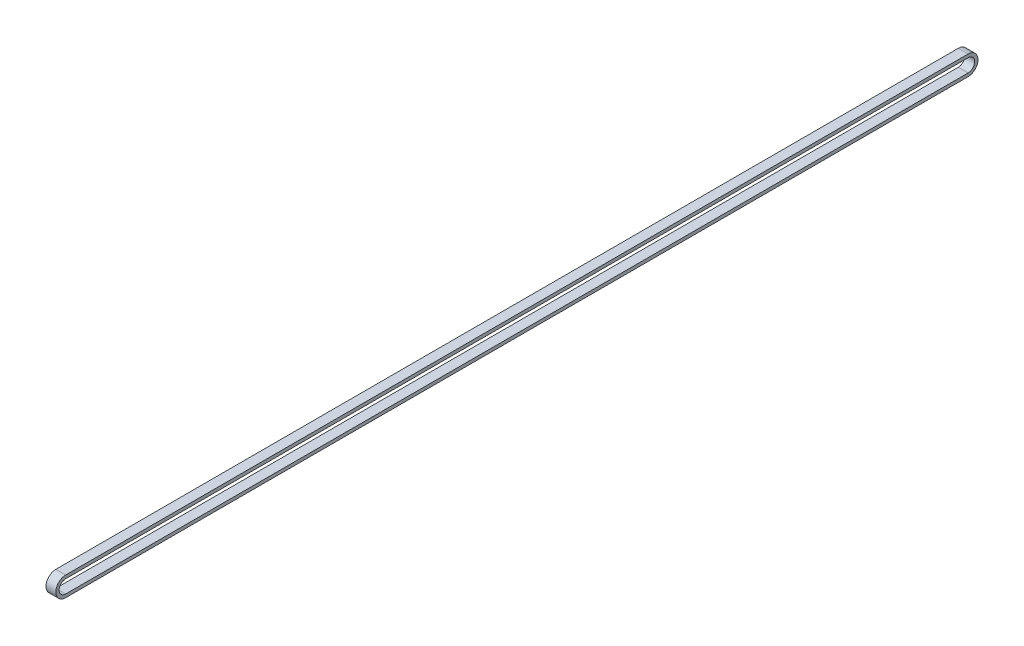
ISO-10303-21;
HEADER;
FILE_DESCRIPTION(('STEP AP214'),'2;1');
FILE_NAME('part.step','',(''),(''),'','','');
FILE_SCHEMA(('AUTOMOTIVE_DESIGN { 1 0 10303 214 1 1 1 1 }'));
ENDSEC;
DATA;
#1=APPLICATION_CONTEXT('core data for automotive mechanical design processes');
#2=APPLICATION_PROTOCOL_DEFINITION('international standard','automotive_design',2000,#1);
#3=PRODUCT_CONTEXT('',#1,'mechanical');
#4=PRODUCT('Part','Part','',(#3));
#5=PRODUCT_RELATED_PRODUCT_CATEGORY('part','',(#4));
#6=PRODUCT_DEFINITION_FORMATION('','',#4);
#7=PRODUCT_DEFINITION_CONTEXT('part definition',#1,'design');
#8=PRODUCT_DEFINITION('design','',#6,#7);
#9=PRODUCT_DEFINITION_SHAPE('','',#8);
#10=(LENGTH_UNIT() NAMED_UNIT(*) SI_UNIT(.MILLI.,.METRE.));
#11=(NAMED_UNIT(*) PLANE_ANGLE_UNIT() SI_UNIT($,.RADIAN.));
#12=(NAMED_UNIT(*) SI_UNIT($,.STERADIAN.) SOLID_ANGLE_UNIT());
#13=UNCERTAINTY_MEASURE_WITH_UNIT(LENGTH_MEASURE(1.E-05),#10,'distance_accuracy_value','');
#14=(GEOMETRIC_REPRESENTATION_CONTEXT(3) GLOBAL_UNCERTAINTY_ASSIGNED_CONTEXT((#13)) GLOBAL_UNIT_ASSIGNED_CONTEXT((#10,
#11,#12)) REPRESENTATION_CONTEXT('',''));
#15=CARTESIAN_POINT('',(0.,0.,0.));
#16=DIRECTION('',(0.,0.,1.));
#17=DIRECTION('',(1.,0.,0.));
#18=AXIS2_PLACEMENT_3D('',#15,#16,#17);
#19=CARTESIAN_POINT('',(6.,4.,0.));
#20=DIRECTION('',(1.,0.,0.));
#21=DIRECTION('',(0.,0.,-1.));
#22=AXIS2_PLACEMENT_3D('',#19,#20,#21);
#23=PLANE('',#22);
#24=CARTESIAN_POINT('',(6.,4.,0.));
#25=DIRECTION('',(1.,0.,0.));
#26=DIRECTION('',(0.,0.,-1.));
#27=AXIS2_PLACEMENT_3D('',#24,#25,#26);
#28=CIRCLE('',#27,6.);
#29=CARTESIAN_POINT('',(6.,10.,0.));
#30=VERTEX_POINT('',#29);
#31=CARTESIAN_POINT('',(6.,-2.,0.));
#32=VERTEX_POINT('',#31);
#33=EDGE_CURVE('E157',#30,#32,#28,.T.);
#34=ORIENTED_EDGE('',*,*,#33,.T.);
#35=DIRECTION('',(0.,0.,-1.));
#36=VECTOR('',#35,1.);
#37=CARTESIAN_POINT('',(6.,-2.,0.));
#38=LINE('',#37,#36);
#39=CARTESIAN_POINT('',(6.,-2.,-550.));
#40=VERTEX_POINT('',#39);
#41=EDGE_CURVE('E161',#32,#40,#38,.T.);
#42=ORIENTED_EDGE('',*,*,#41,.T.);
#43=CARTESIAN_POINT('',(6.,4.,-550.));
#44=DIRECTION('',(1.,0.,0.));
#45=DIRECTION('',(0.,0.,1.));
#46=AXIS2_PLACEMENT_3D('',#43,#44,#45);
#47=CIRCLE('',#46,6.);
#48=CARTESIAN_POINT('',(6.,10.,-550.));
#49=VERTEX_POINT('',#48);
#50=EDGE_CURVE('E165',#40,#49,#47,.T.);
#51=ORIENTED_EDGE('',*,*,#50,.T.);
#52=DIRECTION('',(0.,0.,1.));
#53=VECTOR('',#52,1.);
#54=CARTESIAN_POINT('',(6.,10.,0.));
#55=LINE('',#54,#53);
#56=EDGE_CURVE('E168',#49,#30,#55,.T.);
#57=ORIENTED_EDGE('',*,*,#56,.T.);
#58=EDGE_LOOP('',(#34,#42,#51,#57));
#59=FACE_BOUND('',#58,.T.);
#60=DIRECTION('',(0.,0.,-1.));
#61=VECTOR('',#60,1.);
#62=CARTESIAN_POINT('',(6.,0.,0.));
#63=LINE('',#62,#61);
#64=CARTESIAN_POINT('',(6.,0.,0.));
#65=VERTEX_POINT('',#64);
#66=CARTESIAN_POINT('',(6.,0.,-550.));
#67=VERTEX_POINT('',#66);
#68=EDGE_CURVE('E118',#65,#67,#63,.T.);
#69=ORIENTED_EDGE('',*,*,#68,.F.);
#70=CARTESIAN_POINT('',(6.,4.,0.));
#71=DIRECTION('',(1.,0.,0.));
#72=DIRECTION('',(0.,0.,-1.));
#73=AXIS2_PLACEMENT_3D('',#70,#71,#72);
#74=CIRCLE('',#73,4.);
#75=CARTESIAN_POINT('',(6.,8.,0.));
#76=VERTEX_POINT('',#75);
#77=EDGE_CURVE('E109',#76,#65,#74,.T.);
#78=ORIENTED_EDGE('',*,*,#77,.F.);
#79=DIRECTION('',(0.,0.,1.));
#80=VECTOR('',#79,1.);
#81=CARTESIAN_POINT('',(6.,8.,0.));
#82=LINE('',#81,#80);
#83=CARTESIAN_POINT('',(6.,8.,-550.));
#84=VERTEX_POINT('',#83);
#85=EDGE_CURVE('E135',#84,#76,#82,.T.);
#86=ORIENTED_EDGE('',*,*,#85,.F.);
#87=CARTESIAN_POINT('',(6.,4.,-550.));
#88=DIRECTION('',(1.,0.,0.));
#89=DIRECTION('',(0.,0.,1.));
#90=AXIS2_PLACEMENT_3D('',#87,#88,#89);
#91=CIRCLE('',#90,4.);
#92=EDGE_CURVE('E131',#67,#84,#91,.T.);
#93=ORIENTED_EDGE('',*,*,#92,.F.);
#94=EDGE_LOOP('',(#69,#78,#86,#93));
#95=FACE_BOUND('',#94,.T.);
#96=ADVANCED_FACE('F43',(#59,#95),#23,.T.);
#97=CARTESIAN_POINT('',(0.,4.,0.));
#98=DIRECTION('',(1.,0.,0.));
#99=DIRECTION('',(0.,0.,-1.));
#100=AXIS2_PLACEMENT_3D('',#97,#98,#99);
#101=PLANE('',#100);
#102=CARTESIAN_POINT('',(0.,4.,0.));
#103=DIRECTION('',(1.,0.,0.));
#104=DIRECTION('',(0.,0.,-1.));
#105=AXIS2_PLACEMENT_3D('',#102,#103,#104);
#106=CIRCLE('',#105,6.);
#107=CARTESIAN_POINT('',(0.,10.,0.));
#108=VERTEX_POINT('',#107);
#109=CARTESIAN_POINT('',(0.,-2.,0.));
#110=VERTEX_POINT('',#109);
#111=EDGE_CURVE('E127',#108,#110,#106,.T.);
#112=ORIENTED_EDGE('',*,*,#111,.F.);
#113=DIRECTION('',(0.,0.,1.));
#114=VECTOR('',#113,1.);
#115=CARTESIAN_POINT('',(0.,10.,0.));
#116=LINE('',#115,#114);
#117=CARTESIAN_POINT('',(0.,10.,-550.));
#118=VERTEX_POINT('',#117);
#119=EDGE_CURVE('E162',#118,#108,#116,.T.);
#120=ORIENTED_EDGE('',*,*,#119,.F.);
#121=CARTESIAN_POINT('',(0.,4.,-550.));
#122=DIRECTION('',(1.,0.,0.));
#123=DIRECTION('',(0.,0.,1.));
#124=AXIS2_PLACEMENT_3D('',#121,#122,#123);
#125=CIRCLE('',#124,6.);
#126=CARTESIAN_POINT('',(0.,-2.,-550.));
#127=VERTEX_POINT('',#126);
#128=EDGE_CURVE('E178',#127,#118,#125,.T.);
#129=ORIENTED_EDGE('',*,*,#128,.F.);
#130=DIRECTION('',(0.,0.,-1.));
#131=VECTOR('',#130,1.);
#132=CARTESIAN_POINT('',(0.,-2.,0.));
#133=LINE('',#132,#131);
#134=EDGE_CURVE('E175',#110,#127,#133,.T.);
#135=ORIENTED_EDGE('',*,*,#134,.F.);
#136=EDGE_LOOP('',(#112,#120,#129,#135));
#137=FACE_BOUND('',#136,.T.);
#138=CARTESIAN_POINT('',(0.,4.,0.));
#139=DIRECTION('',(1.,0.,0.));
#140=DIRECTION('',(0.,0.,-1.));
#141=AXIS2_PLACEMENT_3D('',#138,#139,#140);
#142=CIRCLE('',#141,4.);
#143=CARTESIAN_POINT('',(0.,8.,0.));
#144=VERTEX_POINT('',#143);
#145=CARTESIAN_POINT('',(0.,0.,0.));
#146=VERTEX_POINT('',#145);
#147=EDGE_CURVE('E67',#144,#146,#142,.T.);
#148=ORIENTED_EDGE('',*,*,#147,.T.);
#149=DIRECTION('',(0.,0.,-1.));
#150=VECTOR('',#149,1.);
#151=CARTESIAN_POINT('',(0.,0.,0.));
#152=LINE('',#151,#150);
#153=CARTESIAN_POINT('',(0.,0.,-550.));
#154=VERTEX_POINT('',#153);
#155=EDGE_CURVE('E125',#146,#154,#152,.T.);
#156=ORIENTED_EDGE('',*,*,#155,.T.);
#157=CARTESIAN_POINT('',(0.,4.,-550.));
#158=DIRECTION('',(1.,0.,0.));
#159=DIRECTION('',(0.,0.,1.));
#160=AXIS2_PLACEMENT_3D('',#157,#158,#159);
#161=CIRCLE('',#160,4.);
#162=CARTESIAN_POINT('',(0.,8.,-550.));
#163=VERTEX_POINT('',#162);
#164=EDGE_CURVE('E144',#154,#163,#161,.T.);
#165=ORIENTED_EDGE('',*,*,#164,.T.);
#166=DIRECTION('',(0.,0.,1.));
#167=VECTOR('',#166,1.);
#168=CARTESIAN_POINT('',(0.,8.,0.));
#169=LINE('',#168,#167);
#170=EDGE_CURVE('E119',#163,#144,#169,.T.);
#171=ORIENTED_EDGE('',*,*,#170,.T.);
#172=EDGE_LOOP('',(#148,#156,#165,#171));
#173=FACE_BOUND('',#172,.T.);
#174=ADVANCED_FACE('F201',(#137,#173),#101,.F.);
#175=CARTESIAN_POINT('',(6.,4.,0.));
#176=DIRECTION('',(-1.,0.,0.));
#177=DIRECTION('',(0.,0.,1.));
#178=AXIS2_PLACEMENT_3D('',#175,#176,#177);
#179=CYLINDRICAL_SURFACE('',#178,6.);
#180=ORIENTED_EDGE('',*,*,#111,.T.);
#181=DIRECTION('',(-1.,0.,0.));
#182=VECTOR('',#181,1.);
#183=CARTESIAN_POINT('',(6.,-2.,0.));
#184=LINE('',#183,#182);
#185=EDGE_CURVE('E11',#32,#110,#184,.T.);
#186=ORIENTED_EDGE('',*,*,#185,.F.);
#187=ORIENTED_EDGE('',*,*,#33,.F.);
#188=DIRECTION('',(-1.,0.,0.));
#189=VECTOR('',#188,1.);
#190=CARTESIAN_POINT('',(6.,10.,0.));
#191=LINE('',#190,#189);
#192=EDGE_CURVE('E171',#30,#108,#191,.T.);
#193=ORIENTED_EDGE('',*,*,#192,.T.);
#194=EDGE_LOOP('',(#180,#186,#187,#193));
#195=FACE_BOUND('',#194,.T.);
#196=ADVANCED_FACE('F45',(#195),#179,.T.);
#197=CARTESIAN_POINT('',(6.,-2.,0.));
#198=DIRECTION('',(0.,1.,0.));
#199=DIRECTION('',(0.,0.,1.));
#200=AXIS2_PLACEMENT_3D('',#197,#198,#199);
#201=PLANE('',#200);
#202=ORIENTED_EDGE('',*,*,#134,.T.);
#203=DIRECTION('',(-1.,0.,0.));
#204=VECTOR('',#203,1.);
#205=CARTESIAN_POINT('',(6.,-2.,-550.));
#206=LINE('',#205,#204);
#207=EDGE_CURVE('E52',#40,#127,#206,.T.);
#208=ORIENTED_EDGE('',*,*,#207,.F.);
#209=ORIENTED_EDGE('',*,*,#41,.F.);
#210=ORIENTED_EDGE('',*,*,#185,.T.);
#211=EDGE_LOOP('',(#202,#208,#209,#210));
#212=FACE_BOUND('',#211,.T.);
#213=ADVANCED_FACE('F211',(#212),#201,.F.);
#214=CARTESIAN_POINT('',(6.,4.,-550.));
#215=DIRECTION('',(-1.,0.,0.));
#216=DIRECTION('',(0.,0.,1.));
#217=AXIS2_PLACEMENT_3D('',#214,#215,#216);
#218=CYLINDRICAL_SURFACE('',#217,6.);
#219=ORIENTED_EDGE('',*,*,#128,.T.);
#220=DIRECTION('',(-1.,0.,0.));
#221=VECTOR('',#220,1.);
#222=CARTESIAN_POINT('',(6.,10.,-550.));
#223=LINE('',#222,#221);
#224=EDGE_CURVE('E186',#49,#118,#223,.T.);
#225=ORIENTED_EDGE('',*,*,#224,.F.);
#226=ORIENTED_EDGE('',*,*,#50,.F.);
#227=ORIENTED_EDGE('',*,*,#207,.T.);
#228=EDGE_LOOP('',(#219,#225,#226,#227));
#229=FACE_BOUND('',#228,.T.);
#230=ADVANCED_FACE('F195',(#229),#218,.T.);
#231=CARTESIAN_POINT('',(6.,10.,0.));
#232=DIRECTION('',(0.,-1.,0.));
#233=DIRECTION('',(0.,0.,-1.));
#234=AXIS2_PLACEMENT_3D('',#231,#232,#233);
#235=PLANE('',#234);
#236=ORIENTED_EDGE('',*,*,#119,.T.);
#237=ORIENTED_EDGE('',*,*,#192,.F.);
#238=ORIENTED_EDGE('',*,*,#56,.F.);
#239=ORIENTED_EDGE('',*,*,#224,.T.);
#240=EDGE_LOOP('',(#236,#237,#238,#239));
#241=FACE_BOUND('',#240,.T.);
#242=ADVANCED_FACE('F205',(#241),#235,.F.);
#243=CARTESIAN_POINT('',(6.,4.,0.));
#244=DIRECTION('',(-1.,0.,0.));
#245=DIRECTION('',(0.,0.,1.));
#246=AXIS2_PLACEMENT_3D('',#243,#244,#245);
#247=CYLINDRICAL_SURFACE('',#246,4.);
#248=ORIENTED_EDGE('',*,*,#147,.F.);
#249=DIRECTION('',(-1.,0.,0.));
#250=VECTOR('',#249,1.);
#251=CARTESIAN_POINT('',(6.,8.,0.));
#252=LINE('',#251,#250);
#253=EDGE_CURVE('E113',#76,#144,#252,.T.);
#254=ORIENTED_EDGE('',*,*,#253,.F.);
#255=ORIENTED_EDGE('',*,*,#77,.T.);
#256=DIRECTION('',(-1.,0.,0.));
#257=VECTOR('',#256,1.);
#258=CARTESIAN_POINT('',(6.,0.,0.));
#259=LINE('',#258,#257);
#260=EDGE_CURVE('E112',#65,#146,#259,.T.);
#261=ORIENTED_EDGE('',*,*,#260,.T.);
#262=EDGE_LOOP('',(#248,#254,#255,#261));
#263=FACE_BOUND('',#262,.T.);
#264=ADVANCED_FACE('F111',(#263),#247,.F.);
#265=CARTESIAN_POINT('',(6.,0.,0.));
#266=DIRECTION('',(0.,1.,0.));
#267=DIRECTION('',(0.,0.,1.));
#268=AXIS2_PLACEMENT_3D('',#265,#266,#267);
#269=PLANE('',#268);
#270=ORIENTED_EDGE('',*,*,#155,.F.);
#271=ORIENTED_EDGE('',*,*,#260,.F.);
#272=ORIENTED_EDGE('',*,*,#68,.T.);
#273=DIRECTION('',(-1.,0.,0.));
#274=VECTOR('',#273,1.);
#275=CARTESIAN_POINT('',(6.,0.,-550.));
#276=LINE('',#275,#274);
#277=EDGE_CURVE('E128',#67,#154,#276,.T.);
#278=ORIENTED_EDGE('',*,*,#277,.T.);
#279=EDGE_LOOP('',(#270,#271,#272,#278));
#280=FACE_BOUND('',#279,.T.);
#281=ADVANCED_FACE('F122',(#280),#269,.T.);
#282=CARTESIAN_POINT('',(6.,4.,-550.));
#283=DIRECTION('',(-1.,0.,0.));
#284=DIRECTION('',(0.,0.,1.));
#285=AXIS2_PLACEMENT_3D('',#282,#283,#284);
#286=CYLINDRICAL_SURFACE('',#285,4.);
#287=ORIENTED_EDGE('',*,*,#164,.F.);
#288=ORIENTED_EDGE('',*,*,#277,.F.);
#289=ORIENTED_EDGE('',*,*,#92,.T.);
#290=DIRECTION('',(-1.,0.,0.));
#291=VECTOR('',#290,1.);
#292=CARTESIAN_POINT('',(6.,8.,-550.));
#293=LINE('',#292,#291);
#294=EDGE_CURVE('E59',#84,#163,#293,.T.);
#295=ORIENTED_EDGE('',*,*,#294,.T.);
#296=EDGE_LOOP('',(#287,#288,#289,#295));
#297=FACE_BOUND('',#296,.T.);
#298=ADVANCED_FACE('F234',(#297),#286,.F.);
#299=CARTESIAN_POINT('',(6.,8.,0.));
#300=DIRECTION('',(0.,-1.,0.));
#301=DIRECTION('',(0.,0.,-1.));
#302=AXIS2_PLACEMENT_3D('',#299,#300,#301);
#303=PLANE('',#302);
#304=ORIENTED_EDGE('',*,*,#170,.F.);
#305=ORIENTED_EDGE('',*,*,#294,.F.);
#306=ORIENTED_EDGE('',*,*,#85,.T.);
#307=ORIENTED_EDGE('',*,*,#253,.T.);
#308=EDGE_LOOP('',(#304,#305,#306,#307));
#309=FACE_BOUND('',#308,.T.);
#310=ADVANCED_FACE('F238',(#309),#303,.T.);
#311=CLOSED_SHELL('',(#96,#174,#196,#213,#230,#242,#264,#281,#298,#310));
#312=MANIFOLD_SOLID_BREP('B2',#311);
#313=ADVANCED_BREP_SHAPE_REPRESENTATION('',(#18,#312),#14);
#314=SHAPE_DEFINITION_REPRESENTATION(#9,#313);
ENDSEC;
END-ISO-10303-21;
